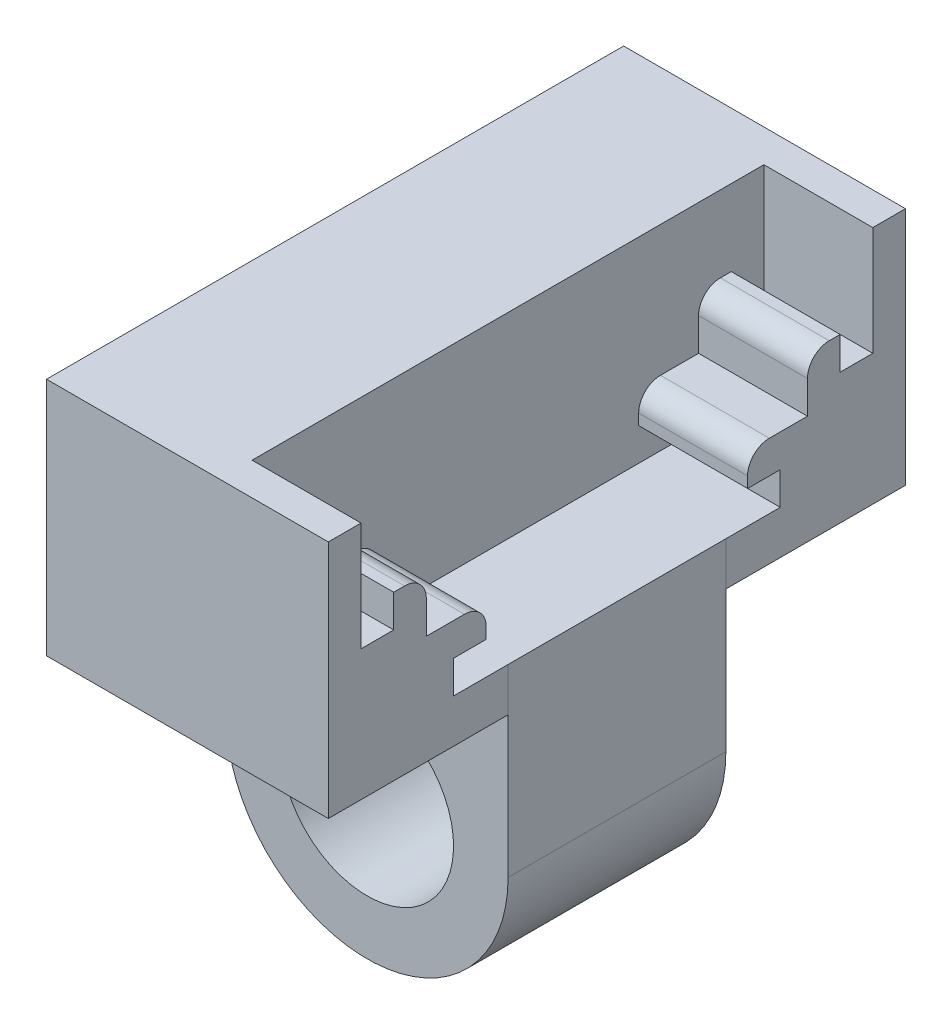
ISO-10303-21;
HEADER;
FILE_DESCRIPTION(('STEP AP214'),'2;1');
FILE_NAME('part.step','',(''),(''),'','','');
FILE_SCHEMA(('AUTOMOTIVE_DESIGN { 1 0 10303 214 1 1 1 1 }'));
ENDSEC;
DATA;
#1=APPLICATION_CONTEXT('core data for automotive mechanical design processes');
#2=APPLICATION_PROTOCOL_DEFINITION('international standard','automotive_design',2000,#1);
#3=PRODUCT_CONTEXT('',#1,'mechanical');
#4=PRODUCT('Part','Part','',(#3));
#5=PRODUCT_RELATED_PRODUCT_CATEGORY('part','',(#4));
#6=PRODUCT_DEFINITION_FORMATION('','',#4);
#7=PRODUCT_DEFINITION_CONTEXT('part definition',#1,'design');
#8=PRODUCT_DEFINITION('design','',#6,#7);
#9=PRODUCT_DEFINITION_SHAPE('','',#8);
#10=(LENGTH_UNIT() NAMED_UNIT(*) SI_UNIT(.MILLI.,.METRE.));
#11=(NAMED_UNIT(*) PLANE_ANGLE_UNIT() SI_UNIT($,.RADIAN.));
#12=(NAMED_UNIT(*) SI_UNIT($,.STERADIAN.) SOLID_ANGLE_UNIT());
#13=UNCERTAINTY_MEASURE_WITH_UNIT(LENGTH_MEASURE(1.E-05),#10,'distance_accuracy_value','');
#14=(GEOMETRIC_REPRESENTATION_CONTEXT(3) GLOBAL_UNCERTAINTY_ASSIGNED_CONTEXT((#13)) GLOBAL_UNIT_ASSIGNED_CONTEXT((#10,
#11,#12)) REPRESENTATION_CONTEXT('',''));
#15=CARTESIAN_POINT('',(0.,0.,0.));
#16=DIRECTION('',(0.,0.,1.));
#17=DIRECTION('',(1.,0.,0.));
#18=AXIS2_PLACEMENT_3D('',#15,#16,#17);
#19=CARTESIAN_POINT('',(10.,-27.5,0.));
#20=DIRECTION('',(0.,1.,0.));
#21=DIRECTION('',(0.,0.,1.));
#22=AXIS2_PLACEMENT_3D('',#19,#20,#21);
#23=PLANE('',#22);
#24=DIRECTION('',(-1.,0.,0.));
#25=VECTOR('',#24,1.);
#26=CARTESIAN_POINT('',(10.,-27.5,10.));
#27=LINE('',#26,#25);
#28=CARTESIAN_POINT('',(10.,-27.5,10.));
#29=VERTEX_POINT('',#28);
#30=CARTESIAN_POINT('',(-15.88,-27.5,9.99999999999999));
#31=VERTEX_POINT('',#30);
#32=EDGE_CURVE('E71',#29,#31,#27,.T.);
#33=ORIENTED_EDGE('',*,*,#32,.F.);
#34=DIRECTION('',(0.,0.,-1.));
#35=VECTOR('',#34,1.);
#36=CARTESIAN_POINT('',(10.,-27.5,0.));
#37=LINE('',#36,#35);
#38=CARTESIAN_POINT('',(10.,-27.5,26.5));
#39=VERTEX_POINT('',#38);
#40=EDGE_CURVE('E514',#39,#29,#37,.T.);
#41=ORIENTED_EDGE('',*,*,#40,.F.);
#42=DIRECTION('',(-1.,0.,0.));
#43=VECTOR('',#42,1.);
#44=CARTESIAN_POINT('',(10.,-27.5,26.5));
#45=LINE('',#44,#43);
#46=CARTESIAN_POINT('',(-15.88,-27.5,26.5));
#47=VERTEX_POINT('',#46);
#48=EDGE_CURVE('E558',#39,#47,#45,.T.);
#49=ORIENTED_EDGE('',*,*,#48,.T.);
#50=DIRECTION('',(0.,0.,1.));
#51=VECTOR('',#50,1.);
#52=CARTESIAN_POINT('',(-15.88,-27.5,26.5));
#53=LINE('',#52,#51);
#54=EDGE_CURVE('E508',#31,#47,#53,.T.);
#55=ORIENTED_EDGE('',*,*,#54,.F.);
#56=EDGE_LOOP('',(#33,#41,#49,#55));
#57=FACE_BOUND('',#56,.T.);
#58=ADVANCED_FACE('F47',(#57),#23,.F.);
#59=CARTESIAN_POINT('',(10.,0.,0.));
#60=DIRECTION('',(-1.,0.,0.));
#61=DIRECTION('',(0.,0.,1.));
#62=AXIS2_PLACEMENT_3D('',#59,#60,#61);
#63=PLANE('',#62);
#64=DIRECTION('',(0.,-1.,0.));
#65=VECTOR('',#64,1.);
#66=CARTESIAN_POINT('',(10.,0.,10.));
#67=LINE('',#66,#65);
#68=CARTESIAN_POINT('',(10.,-23.5,10.));
#69=VERTEX_POINT('',#68);
#70=EDGE_CURVE('E63',#69,#29,#67,.T.);
#71=ORIENTED_EDGE('',*,*,#70,.F.);
#72=DIRECTION('',(0.,0.,1.));
#73=VECTOR('',#72,1.);
#74=CARTESIAN_POINT('',(10.,-23.5,15.));
#75=LINE('',#74,#73);
#76=CARTESIAN_POINT('',(10.,-23.5,15.));
#77=VERTEX_POINT('',#76);
#78=EDGE_CURVE('E517',#69,#77,#75,.T.);
#79=ORIENTED_EDGE('',*,*,#78,.T.);
#80=DIRECTION('',(0.,1.,0.));
#81=VECTOR('',#80,1.);
#82=CARTESIAN_POINT('',(10.,-20.5,15.));
#83=LINE('',#82,#81);
#84=CARTESIAN_POINT('',(10.,-20.5,15.));
#85=VERTEX_POINT('',#84);
#86=EDGE_CURVE('E523',#77,#85,#83,.T.);
#87=ORIENTED_EDGE('',*,*,#86,.T.);
#88=DIRECTION('',(0.,0.,-1.));
#89=VECTOR('',#88,1.);
#90=CARTESIAN_POINT('',(10.,-20.5,12.));
#91=LINE('',#90,#89);
#92=CARTESIAN_POINT('',(10.,-20.5,12.));
#93=VERTEX_POINT('',#92);
#94=EDGE_CURVE('E526',#85,#93,#91,.T.);
#95=ORIENTED_EDGE('',*,*,#94,.T.);
#96=DIRECTION('',(0.,1.,0.));
#97=VECTOR('',#96,1.);
#98=CARTESIAN_POINT('',(10.,-20.5,12.));
#99=LINE('',#98,#97);
#100=CARTESIAN_POINT('',(10.,-19.5,12.));
#101=VERTEX_POINT('',#100);
#102=EDGE_CURVE('E529',#93,#101,#99,.T.);
#103=ORIENTED_EDGE('',*,*,#102,.T.);
#104=CARTESIAN_POINT('',(10.,-19.5,14.));
#105=DIRECTION('',(-1.,0.,0.));
#106=DIRECTION('',(0.,0.,1.));
#107=AXIS2_PLACEMENT_3D('',#104,#105,#106);
#108=CIRCLE('',#107,2.);
#109=CARTESIAN_POINT('',(10.,-17.5,14.));
#110=VERTEX_POINT('',#109);
#111=EDGE_CURVE('E650',#101,#110,#108,.F.);
#112=ORIENTED_EDGE('',*,*,#111,.T.);
#113=DIRECTION('',(0.,0.,1.));
#114=VECTOR('',#113,1.);
#115=CARTESIAN_POINT('',(10.,-17.5,17.5));
#116=LINE('',#115,#114);
#117=CARTESIAN_POINT('',(10.,-17.5,17.5));
#118=VERTEX_POINT('',#117);
#119=EDGE_CURVE('E533',#110,#118,#116,.T.);
#120=ORIENTED_EDGE('',*,*,#119,.T.);
#121=DIRECTION('',(0.,1.,0.));
#122=VECTOR('',#121,1.);
#123=CARTESIAN_POINT('',(10.,-12.5,17.5));
#124=LINE('',#123,#122);
#125=CARTESIAN_POINT('',(10.,-14.5,17.5));
#126=VERTEX_POINT('',#125);
#127=EDGE_CURVE('E536',#118,#126,#124,.T.);
#128=ORIENTED_EDGE('',*,*,#127,.T.);
#129=CARTESIAN_POINT('',(10.,-14.5,19.5));
#130=DIRECTION('',(-1.,0.,0.));
#131=DIRECTION('',(0.,0.,1.));
#132=AXIS2_PLACEMENT_3D('',#129,#130,#131);
#133=CIRCLE('',#132,2.);
#134=CARTESIAN_POINT('',(10.,-12.5,19.5));
#135=VERTEX_POINT('',#134);
#136=EDGE_CURVE('E647',#126,#135,#133,.F.);
#137=ORIENTED_EDGE('',*,*,#136,.T.);
#138=DIRECTION('',(0.,0.,1.));
#139=VECTOR('',#138,1.);
#140=CARTESIAN_POINT('',(10.,-12.5,20.5));
#141=LINE('',#140,#139);
#142=CARTESIAN_POINT('',(10.,-12.5,20.5));
#143=VERTEX_POINT('',#142);
#144=EDGE_CURVE('E540',#135,#143,#141,.T.);
#145=ORIENTED_EDGE('',*,*,#144,.T.);
#146=DIRECTION('',(0.,-1.,0.));
#147=VECTOR('',#146,1.);
#148=CARTESIAN_POINT('',(10.,-15.5,20.5));
#149=LINE('',#148,#147);
#150=CARTESIAN_POINT('',(10.,-15.5,20.5));
#151=VERTEX_POINT('',#150);
#152=EDGE_CURVE('E543',#143,#151,#149,.T.);
#153=ORIENTED_EDGE('',*,*,#152,.T.);
#154=DIRECTION('',(0.,0.,1.));
#155=VECTOR('',#154,1.);
#156=CARTESIAN_POINT('',(10.,-15.5,23.5));
#157=LINE('',#156,#155);
#158=CARTESIAN_POINT('',(10.,-15.5,23.5));
#159=VERTEX_POINT('',#158);
#160=EDGE_CURVE('E546',#151,#159,#157,.T.);
#161=ORIENTED_EDGE('',*,*,#160,.T.);
#162=DIRECTION('',(0.,1.,0.));
#163=VECTOR('',#162,1.);
#164=CARTESIAN_POINT('',(10.,-5.50000000000001,23.5));
#165=LINE('',#164,#163);
#166=CARTESIAN_POINT('',(10.,-5.50000000000001,23.5));
#167=VERTEX_POINT('',#166);
#168=EDGE_CURVE('E549',#159,#167,#165,.T.);
#169=ORIENTED_EDGE('',*,*,#168,.T.);
#170=DIRECTION('',(0.,0.,1.));
#171=VECTOR('',#170,1.);
#172=CARTESIAN_POINT('',(10.,-5.50000000000001,23.5));
#173=LINE('',#172,#171);
#174=CARTESIAN_POINT('',(10.,-5.50000000000001,26.5));
#175=VERTEX_POINT('',#174);
#176=EDGE_CURVE('E552',#167,#175,#173,.T.);
#177=ORIENTED_EDGE('',*,*,#176,.T.);
#178=DIRECTION('',(0.,-1.,0.));
#179=VECTOR('',#178,1.);
#180=CARTESIAN_POINT('',(10.,-27.5,26.5));
#181=LINE('',#180,#179);
#182=EDGE_CURVE('E555',#175,#39,#181,.T.);
#183=ORIENTED_EDGE('',*,*,#182,.T.);
#184=ORIENTED_EDGE('',*,*,#40,.T.);
#185=EDGE_LOOP('',(#71,#79,#87,#95,#103,#112,#120,#128,#137,#145,#153,#161,#169,#177,#183,#184));
#186=FACE_BOUND('',#185,.T.);
#187=ADVANCED_FACE('F664',(#186),#63,.F.);
#188=CARTESIAN_POINT('',(10.,-23.5,15.));
#189=DIRECTION('',(0.,-1.,0.));
#190=DIRECTION('',(0.,0.,-1.));
#191=AXIS2_PLACEMENT_3D('',#188,#189,#190);
#192=PLANE('',#191);
#193=DIRECTION('',(0.,0.,1.));
#194=VECTOR('',#193,1.);
#195=CARTESIAN_POINT('',(0.,-23.5,15.));
#196=LINE('',#195,#194);
#197=CARTESIAN_POINT('',(0.,-23.5,-15.));
#198=VERTEX_POINT('',#197);
#199=CARTESIAN_POINT('',(0.,-23.5,15.));
#200=VERTEX_POINT('',#199);
#201=EDGE_CURVE('E511',#198,#200,#196,.T.);
#202=ORIENTED_EDGE('',*,*,#201,.T.);
#203=DIRECTION('',(-1.,0.,0.));
#204=VECTOR('',#203,1.);
#205=CARTESIAN_POINT('',(10.,-23.5,15.));
#206=LINE('',#205,#204);
#207=EDGE_CURVE('E630',#77,#200,#206,.T.);
#208=ORIENTED_EDGE('',*,*,#207,.F.);
#209=ORIENTED_EDGE('',*,*,#78,.F.);
#210=CARTESIAN_POINT('',(10.,-23.5,-10.));
#211=VERTEX_POINT('',#210);
#212=EDGE_CURVE('E519',#211,#69,#75,.T.);
#213=ORIENTED_EDGE('',*,*,#212,.F.);
#214=DIRECTION('',(0.,0.,-1.));
#215=VECTOR('',#214,1.);
#216=CARTESIAN_POINT('',(10.,-23.5,-15.));
#217=LINE('',#216,#215);
#218=CARTESIAN_POINT('',(10.,-23.5,-15.));
#219=VERTEX_POINT('',#218);
#220=EDGE_CURVE('E326',#211,#219,#217,.T.);
#221=ORIENTED_EDGE('',*,*,#220,.T.);
#222=DIRECTION('',(-1.,0.,0.));
#223=VECTOR('',#222,1.);
#224=CARTESIAN_POINT('',(10.,-23.5,-15.));
#225=LINE('',#224,#223);
#226=EDGE_CURVE('E444',#219,#198,#225,.T.);
#227=ORIENTED_EDGE('',*,*,#226,.T.);
#228=EDGE_LOOP('',(#202,#208,#209,#213,#221,#227));
#229=FACE_BOUND('',#228,.T.);
#230=ADVANCED_FACE('F701',(#229),#192,.F.);
#231=CARTESIAN_POINT('',(10.,-20.5,15.));
#232=DIRECTION('',(0.,0.,1.));
#233=DIRECTION('',(1.,0.,0.));
#234=AXIS2_PLACEMENT_3D('',#231,#232,#233);
#235=PLANE('',#234);
#236=DIRECTION('',(0.,1.,0.));
#237=VECTOR('',#236,1.);
#238=CARTESIAN_POINT('',(0.,-20.5,15.));
#239=LINE('',#238,#237);
#240=CARTESIAN_POINT('',(0.,-20.5,15.));
#241=VERTEX_POINT('',#240);
#242=EDGE_CURVE('E561',#200,#241,#239,.T.);
#243=ORIENTED_EDGE('',*,*,#242,.T.);
#244=DIRECTION('',(-1.,0.,0.));
#245=VECTOR('',#244,1.);
#246=CARTESIAN_POINT('',(10.,-20.5,15.));
#247=LINE('',#246,#245);
#248=EDGE_CURVE('E626',#85,#241,#247,.T.);
#249=ORIENTED_EDGE('',*,*,#248,.F.);
#250=ORIENTED_EDGE('',*,*,#86,.F.);
#251=ORIENTED_EDGE('',*,*,#207,.T.);
#252=EDGE_LOOP('',(#243,#249,#250,#251));
#253=FACE_BOUND('',#252,.T.);
#254=ADVANCED_FACE('F710',(#253),#235,.F.);
#255=CARTESIAN_POINT('',(10.,-20.5,12.));
#256=DIRECTION('',(0.,1.,0.));
#257=DIRECTION('',(0.,0.,1.));
#258=AXIS2_PLACEMENT_3D('',#255,#256,#257);
#259=PLANE('',#258);
#260=DIRECTION('',(0.,0.,-1.));
#261=VECTOR('',#260,1.);
#262=CARTESIAN_POINT('',(0.,-20.5,12.));
#263=LINE('',#262,#261);
#264=CARTESIAN_POINT('',(0.,-20.5,12.));
#265=VERTEX_POINT('',#264);
#266=EDGE_CURVE('E565',#241,#265,#263,.T.);
#267=ORIENTED_EDGE('',*,*,#266,.T.);
#268=DIRECTION('',(-1.,0.,0.));
#269=VECTOR('',#268,1.);
#270=CARTESIAN_POINT('',(10.,-20.5,12.));
#271=LINE('',#270,#269);
#272=EDGE_CURVE('E622',#93,#265,#271,.T.);
#273=ORIENTED_EDGE('',*,*,#272,.F.);
#274=ORIENTED_EDGE('',*,*,#94,.F.);
#275=ORIENTED_EDGE('',*,*,#248,.T.);
#276=EDGE_LOOP('',(#267,#273,#274,#275));
#277=FACE_BOUND('',#276,.T.);
#278=ADVANCED_FACE('F713',(#277),#259,.F.);
#279=CARTESIAN_POINT('',(10.,-20.5,12.));
#280=DIRECTION('',(0.,0.,1.));
#281=DIRECTION('',(0.,-1.,0.));
#282=AXIS2_PLACEMENT_3D('',#279,#280,#281);
#283=PLANE('',#282);
#284=DIRECTION('',(0.,1.,0.));
#285=VECTOR('',#284,1.);
#286=CARTESIAN_POINT('',(0.,-20.5,12.));
#287=LINE('',#286,#285);
#288=CARTESIAN_POINT('',(0.,-19.5,12.));
#289=VERTEX_POINT('',#288);
#290=EDGE_CURVE('E569',#265,#289,#287,.T.);
#291=ORIENTED_EDGE('',*,*,#290,.T.);
#292=DIRECTION('',(-1.,0.,0.));
#293=VECTOR('',#292,1.);
#294=CARTESIAN_POINT('',(10.,-19.5,12.));
#295=LINE('',#294,#293);
#296=EDGE_CURVE('E644',#289,#101,#295,.F.);
#297=ORIENTED_EDGE('',*,*,#296,.T.);
#298=ORIENTED_EDGE('',*,*,#102,.F.);
#299=ORIENTED_EDGE('',*,*,#272,.T.);
#300=EDGE_LOOP('',(#291,#297,#298,#299));
#301=FACE_BOUND('',#300,.T.);
#302=ADVANCED_FACE('F716',(#301),#283,.F.);
#303=CARTESIAN_POINT('',(10.,-17.5,17.5));
#304=DIRECTION('',(0.,-1.,0.));
#305=DIRECTION('',(0.,0.,-1.));
#306=AXIS2_PLACEMENT_3D('',#303,#304,#305);
#307=PLANE('',#306);
#308=ORIENTED_EDGE('',*,*,#119,.F.);
#309=DIRECTION('',(-1.,0.,0.));
#310=VECTOR('',#309,1.);
#311=CARTESIAN_POINT('',(10.,-17.5,14.));
#312=LINE('',#311,#310);
#313=CARTESIAN_POINT('',(0.,-17.5,14.));
#314=VERTEX_POINT('',#313);
#315=EDGE_CURVE('E634',#110,#314,#312,.T.);
#316=ORIENTED_EDGE('',*,*,#315,.T.);
#317=DIRECTION('',(0.,0.,1.));
#318=VECTOR('',#317,1.);
#319=CARTESIAN_POINT('',(0.,-17.5,17.5));
#320=LINE('',#319,#318);
#321=CARTESIAN_POINT('',(0.,-17.5,17.5));
#322=VERTEX_POINT('',#321);
#323=EDGE_CURVE('E573',#314,#322,#320,.T.);
#324=ORIENTED_EDGE('',*,*,#323,.T.);
#325=DIRECTION('',(-1.,0.,0.));
#326=VECTOR('',#325,1.);
#327=CARTESIAN_POINT('',(10.,-17.5,17.5));
#328=LINE('',#327,#326);
#329=EDGE_CURVE('E618',#118,#322,#328,.T.);
#330=ORIENTED_EDGE('',*,*,#329,.F.);
#331=EDGE_LOOP('',(#308,#316,#324,#330));
#332=FACE_BOUND('',#331,.T.);
#333=ADVANCED_FACE('F724',(#332),#307,.F.);
#334=CARTESIAN_POINT('',(10.,-12.5,17.5));
#335=DIRECTION('',(0.,0.,1.));
#336=DIRECTION('',(1.,0.,0.));
#337=AXIS2_PLACEMENT_3D('',#334,#335,#336);
#338=PLANE('',#337);
#339=DIRECTION('',(0.,1.,0.));
#340=VECTOR('',#339,1.);
#341=CARTESIAN_POINT('',(0.,-12.5,17.5));
#342=LINE('',#341,#340);
#343=CARTESIAN_POINT('',(0.,-14.5,17.5));
#344=VERTEX_POINT('',#343);
#345=EDGE_CURVE('E577',#322,#344,#342,.T.);
#346=ORIENTED_EDGE('',*,*,#345,.T.);
#347=DIRECTION('',(-1.,0.,0.));
#348=VECTOR('',#347,1.);
#349=CARTESIAN_POINT('',(10.,-14.5,17.5));
#350=LINE('',#349,#348);
#351=EDGE_CURVE('E56',#344,#126,#350,.F.);
#352=ORIENTED_EDGE('',*,*,#351,.T.);
#353=ORIENTED_EDGE('',*,*,#127,.F.);
#354=ORIENTED_EDGE('',*,*,#329,.T.);
#355=EDGE_LOOP('',(#346,#352,#353,#354));
#356=FACE_BOUND('',#355,.T.);
#357=ADVANCED_FACE('F660',(#356),#338,.F.);
#358=CARTESIAN_POINT('',(10.,-12.5,20.5));
#359=DIRECTION('',(0.,-1.,0.));
#360=DIRECTION('',(0.,0.,-1.));
#361=AXIS2_PLACEMENT_3D('',#358,#359,#360);
#362=PLANE('',#361);
#363=ORIENTED_EDGE('',*,*,#144,.F.);
#364=DIRECTION('',(-1.,0.,0.));
#365=VECTOR('',#364,1.);
#366=CARTESIAN_POINT('',(10.,-12.5,19.5));
#367=LINE('',#366,#365);
#368=CARTESIAN_POINT('',(0.,-12.5,19.5));
#369=VERTEX_POINT('',#368);
#370=EDGE_CURVE('E653',#135,#369,#367,.T.);
#371=ORIENTED_EDGE('',*,*,#370,.T.);
#372=DIRECTION('',(0.,0.,1.));
#373=VECTOR('',#372,1.);
#374=CARTESIAN_POINT('',(0.,-12.5,20.5));
#375=LINE('',#374,#373);
#376=CARTESIAN_POINT('',(0.,-12.5,20.5));
#377=VERTEX_POINT('',#376);
#378=EDGE_CURVE('E581',#369,#377,#375,.T.);
#379=ORIENTED_EDGE('',*,*,#378,.T.);
#380=DIRECTION('',(-1.,0.,0.));
#381=VECTOR('',#380,1.);
#382=CARTESIAN_POINT('',(10.,-12.5,20.5));
#383=LINE('',#382,#381);
#384=EDGE_CURVE('E614',#143,#377,#383,.T.);
#385=ORIENTED_EDGE('',*,*,#384,.F.);
#386=EDGE_LOOP('',(#363,#371,#379,#385));
#387=FACE_BOUND('',#386,.T.);
#388=ADVANCED_FACE('F670',(#387),#362,.F.);
#389=CARTESIAN_POINT('',(10.,-15.5,20.5));
#390=DIRECTION('',(0.,0.,-1.));
#391=DIRECTION('',(-1.,0.,0.));
#392=AXIS2_PLACEMENT_3D('',#389,#390,#391);
#393=PLANE('',#392);
#394=DIRECTION('',(0.,-1.,0.));
#395=VECTOR('',#394,1.);
#396=CARTESIAN_POINT('',(0.,-15.5,20.5));
#397=LINE('',#396,#395);
#398=CARTESIAN_POINT('',(0.,-15.5,20.5));
#399=VERTEX_POINT('',#398);
#400=EDGE_CURVE('E585',#377,#399,#397,.T.);
#401=ORIENTED_EDGE('',*,*,#400,.T.);
#402=DIRECTION('',(-1.,0.,0.));
#403=VECTOR('',#402,1.);
#404=CARTESIAN_POINT('',(10.,-15.5,20.5));
#405=LINE('',#404,#403);
#406=EDGE_CURVE('E610',#151,#399,#405,.T.);
#407=ORIENTED_EDGE('',*,*,#406,.F.);
#408=ORIENTED_EDGE('',*,*,#152,.F.);
#409=ORIENTED_EDGE('',*,*,#384,.T.);
#410=EDGE_LOOP('',(#401,#407,#408,#409));
#411=FACE_BOUND('',#410,.T.);
#412=ADVANCED_FACE('F677',(#411),#393,.F.);
#413=CARTESIAN_POINT('',(10.,-15.5,23.5));
#414=DIRECTION('',(0.,-1.,0.));
#415=DIRECTION('',(0.,0.,-1.));
#416=AXIS2_PLACEMENT_3D('',#413,#414,#415);
#417=PLANE('',#416);
#418=DIRECTION('',(0.,0.,1.));
#419=VECTOR('',#418,1.);
#420=CARTESIAN_POINT('',(0.,-15.5,23.5));
#421=LINE('',#420,#419);
#422=CARTESIAN_POINT('',(0.,-15.5,23.5));
#423=VERTEX_POINT('',#422);
#424=EDGE_CURVE('E589',#399,#423,#421,.T.);
#425=ORIENTED_EDGE('',*,*,#424,.T.);
#426=DIRECTION('',(-1.,0.,0.));
#427=VECTOR('',#426,1.);
#428=CARTESIAN_POINT('',(10.,-15.5,23.5));
#429=LINE('',#428,#427);
#430=EDGE_CURVE('E606',#159,#423,#429,.T.);
#431=ORIENTED_EDGE('',*,*,#430,.F.);
#432=ORIENTED_EDGE('',*,*,#160,.F.);
#433=ORIENTED_EDGE('',*,*,#406,.T.);
#434=EDGE_LOOP('',(#425,#431,#432,#433));
#435=FACE_BOUND('',#434,.T.);
#436=ADVANCED_FACE('F679',(#435),#417,.F.);
#437=CARTESIAN_POINT('',(10.,-5.50000000000001,23.5));
#438=DIRECTION('',(0.,0.,1.));
#439=DIRECTION('',(0.,-1.,0.));
#440=AXIS2_PLACEMENT_3D('',#437,#438,#439);
#441=PLANE('',#440);
#442=DIRECTION('',(0.,1.,0.));
#443=VECTOR('',#442,1.);
#444=CARTESIAN_POINT('',(0.,-5.50000000000001,23.5));
#445=LINE('',#444,#443);
#446=CARTESIAN_POINT('',(0.,-5.50000000000001,23.5));
#447=VERTEX_POINT('',#446);
#448=EDGE_CURVE('E518',#423,#447,#445,.T.);
#449=ORIENTED_EDGE('',*,*,#448,.T.);
#450=DIRECTION('',(-1.,0.,0.));
#451=VECTOR('',#450,1.);
#452=CARTESIAN_POINT('',(10.,-5.50000000000001,23.5));
#453=LINE('',#452,#451);
#454=EDGE_CURVE('E602',#167,#447,#453,.T.);
#455=ORIENTED_EDGE('',*,*,#454,.F.);
#456=ORIENTED_EDGE('',*,*,#168,.F.);
#457=ORIENTED_EDGE('',*,*,#430,.T.);
#458=EDGE_LOOP('',(#449,#455,#456,#457));
#459=FACE_BOUND('',#458,.T.);
#460=ADVANCED_FACE('F683',(#459),#441,.F.);
#461=CARTESIAN_POINT('',(10.,-5.50000000000001,23.5));
#462=DIRECTION('',(0.,-1.,0.));
#463=DIRECTION('',(0.,0.,-1.));
#464=AXIS2_PLACEMENT_3D('',#461,#462,#463);
#465=PLANE('',#464);
#466=ORIENTED_EDGE('',*,*,#454,.T.);
#467=DIRECTION('',(0.,0.,-1.));
#468=VECTOR('',#467,1.);
#469=CARTESIAN_POINT('',(0.,-5.50000000000001,26.5));
#470=LINE('',#469,#468);
#471=CARTESIAN_POINT('',(0.,-5.5,-23.5));
#472=VERTEX_POINT('',#471);
#473=EDGE_CURVE('E500',#447,#472,#470,.T.);
#474=ORIENTED_EDGE('',*,*,#473,.T.);
#475=DIRECTION('',(-1.,0.,0.));
#476=VECTOR('',#475,1.);
#477=CARTESIAN_POINT('',(10.,-5.5,-23.5));
#478=LINE('',#477,#476);
#479=CARTESIAN_POINT('',(10.,-5.5,-23.5));
#480=VERTEX_POINT('',#479);
#481=EDGE_CURVE('E416',#480,#472,#478,.T.);
#482=ORIENTED_EDGE('',*,*,#481,.F.);
#483=DIRECTION('',(0.,0.,-1.));
#484=VECTOR('',#483,1.);
#485=CARTESIAN_POINT('',(10.,-5.5,-23.5));
#486=LINE('',#485,#484);
#487=CARTESIAN_POINT('',(10.,-5.5,-26.5));
#488=VERTEX_POINT('',#487);
#489=EDGE_CURVE('E367',#480,#488,#486,.T.);
#490=ORIENTED_EDGE('',*,*,#489,.T.);
#491=DIRECTION('',(-1.,0.,0.));
#492=VECTOR('',#491,1.);
#493=CARTESIAN_POINT('',(10.,-5.5,-26.5));
#494=LINE('',#493,#492);
#495=CARTESIAN_POINT('',(-15.88,-5.5,-26.5));
#496=VERTEX_POINT('',#495);
#497=EDGE_CURVE('E412',#488,#496,#494,.T.);
#498=ORIENTED_EDGE('',*,*,#497,.T.);
#499=DIRECTION('',(0.,0.,-1.));
#500=VECTOR('',#499,1.);
#501=CARTESIAN_POINT('',(-15.88,-5.50000000000001,26.5));
#502=LINE('',#501,#500);
#503=CARTESIAN_POINT('',(-15.88,-5.50000000000001,26.5));
#504=VERTEX_POINT('',#503);
#505=EDGE_CURVE('E505',#504,#496,#502,.T.);
#506=ORIENTED_EDGE('',*,*,#505,.F.);
#507=DIRECTION('',(-1.,0.,0.));
#508=VECTOR('',#507,1.);
#509=CARTESIAN_POINT('',(10.,-5.50000000000001,26.5));
#510=LINE('',#509,#508);
#511=EDGE_CURVE('E599',#175,#504,#510,.T.);
#512=ORIENTED_EDGE('',*,*,#511,.F.);
#513=ORIENTED_EDGE('',*,*,#176,.F.);
#514=EDGE_LOOP('',(#466,#474,#482,#490,#498,#506,#512,#513));
#515=FACE_BOUND('',#514,.T.);
#516=ADVANCED_FACE('F690',(#515),#465,.F.);
#517=CARTESIAN_POINT('',(10.,-27.5,26.5));
#518=DIRECTION('',(0.,0.,-1.));
#519=DIRECTION('',(-1.,0.,0.));
#520=AXIS2_PLACEMENT_3D('',#517,#518,#519);
#521=PLANE('',#520);
#522=ORIENTED_EDGE('',*,*,#511,.T.);
#523=DIRECTION('',(0.,1.,0.));
#524=VECTOR('',#523,1.);
#525=CARTESIAN_POINT('',(-15.88,-5.50000000000001,26.5));
#526=LINE('',#525,#524);
#527=EDGE_CURVE('E501',#47,#504,#526,.T.);
#528=ORIENTED_EDGE('',*,*,#527,.F.);
#529=ORIENTED_EDGE('',*,*,#48,.F.);
#530=ORIENTED_EDGE('',*,*,#182,.F.);
#531=EDGE_LOOP('',(#522,#528,#529,#530));
#532=FACE_BOUND('',#531,.T.);
#533=ADVANCED_FACE('F693',(#532),#521,.F.);
#534=CARTESIAN_POINT('',(10.,-19.5,14.));
#535=DIRECTION('',(-1.,0.,0.));
#536=DIRECTION('',(0.,0.,1.));
#537=AXIS2_PLACEMENT_3D('',#534,#535,#536);
#538=CYLINDRICAL_SURFACE('',#537,2.);
#539=ORIENTED_EDGE('',*,*,#111,.F.);
#540=ORIENTED_EDGE('',*,*,#296,.F.);
#541=CARTESIAN_POINT('',(0.,-19.5,14.));
#542=DIRECTION('',(-1.,0.,0.));
#543=DIRECTION('',(0.,0.,1.));
#544=AXIS2_PLACEMENT_3D('',#541,#542,#543);
#545=CIRCLE('',#544,2.);
#546=EDGE_CURVE('E641',#314,#289,#545,.T.);
#547=ORIENTED_EDGE('',*,*,#546,.F.);
#548=ORIENTED_EDGE('',*,*,#315,.F.);
#549=EDGE_LOOP('',(#539,#540,#547,#548));
#550=FACE_BOUND('',#549,.T.);
#551=ADVANCED_FACE('F721',(#550),#538,.T.);
#552=CARTESIAN_POINT('',(10.,-14.5,19.5));
#553=DIRECTION('',(-1.,0.,0.));
#554=DIRECTION('',(0.,0.,1.));
#555=AXIS2_PLACEMENT_3D('',#552,#553,#554);
#556=CYLINDRICAL_SURFACE('',#555,2.);
#557=ORIENTED_EDGE('',*,*,#136,.F.);
#558=ORIENTED_EDGE('',*,*,#351,.F.);
#559=CARTESIAN_POINT('',(0.,-14.5,19.5));
#560=DIRECTION('',(-1.,0.,0.));
#561=DIRECTION('',(0.,0.,1.));
#562=AXIS2_PLACEMENT_3D('',#559,#560,#561);
#563=CIRCLE('',#562,2.);
#564=EDGE_CURVE('E638',#369,#344,#563,.T.);
#565=ORIENTED_EDGE('',*,*,#564,.F.);
#566=ORIENTED_EDGE('',*,*,#370,.F.);
#567=EDGE_LOOP('',(#557,#558,#565,#566));
#568=FACE_BOUND('',#567,.T.);
#569=ADVANCED_FACE('F49',(#568),#556,.T.);
#570=CARTESIAN_POINT('',(0.,0.,0.));
#571=DIRECTION('',(1.,0.,0.));
#572=DIRECTION('',(0.,0.,-1.));
#573=AXIS2_PLACEMENT_3D('',#570,#571,#572);
#574=PLANE('',#573);
#575=ORIENTED_EDGE('',*,*,#201,.F.);
#576=DIRECTION('',(0.,1.,0.));
#577=VECTOR('',#576,1.);
#578=CARTESIAN_POINT('',(0.,-20.5,-15.));
#579=LINE('',#578,#577);
#580=CARTESIAN_POINT('',(0.,-20.5,-15.));
#581=VERTEX_POINT('',#580);
#582=EDGE_CURVE('E321',#198,#581,#579,.T.);
#583=ORIENTED_EDGE('',*,*,#582,.T.);
#584=DIRECTION('',(0.,0.,1.));
#585=VECTOR('',#584,1.);
#586=CARTESIAN_POINT('',(0.,-20.5,-12.));
#587=LINE('',#586,#585);
#588=CARTESIAN_POINT('',(0.,-20.5,-12.));
#589=VERTEX_POINT('',#588);
#590=EDGE_CURVE('E378',#581,#589,#587,.T.);
#591=ORIENTED_EDGE('',*,*,#590,.T.);
#592=DIRECTION('',(0.,1.,0.));
#593=VECTOR('',#592,1.);
#594=CARTESIAN_POINT('',(0.,-20.5,-12.));
#595=LINE('',#594,#593);
#596=CARTESIAN_POINT('',(0.,-19.5,-12.));
#597=VERTEX_POINT('',#596);
#598=EDGE_CURVE('E382',#589,#597,#595,.T.);
#599=ORIENTED_EDGE('',*,*,#598,.T.);
#600=CARTESIAN_POINT('',(0.,-19.5,-14.));
#601=DIRECTION('',(1.,0.,0.));
#602=DIRECTION('',(0.,0.,-1.));
#603=AXIS2_PLACEMENT_3D('',#600,#601,#602);
#604=CIRCLE('',#603,2.);
#605=CARTESIAN_POINT('',(0.,-17.5,-14.));
#606=VERTEX_POINT('',#605);
#607=EDGE_CURVE('E455',#606,#597,#604,.T.);
#608=ORIENTED_EDGE('',*,*,#607,.F.);
#609=DIRECTION('',(0.,0.,-1.));
#610=VECTOR('',#609,1.);
#611=CARTESIAN_POINT('',(0.,-17.5,-17.5));
#612=LINE('',#611,#610);
#613=CARTESIAN_POINT('',(0.,-17.5,-17.5));
#614=VERTEX_POINT('',#613);
#615=EDGE_CURVE('E386',#606,#614,#612,.T.);
#616=ORIENTED_EDGE('',*,*,#615,.T.);
#617=DIRECTION('',(0.,1.,0.));
#618=VECTOR('',#617,1.);
#619=CARTESIAN_POINT('',(0.,-12.5,-17.5));
#620=LINE('',#619,#618);
#621=CARTESIAN_POINT('',(0.,-14.5,-17.5));
#622=VERTEX_POINT('',#621);
#623=EDGE_CURVE('E390',#614,#622,#620,.T.);
#624=ORIENTED_EDGE('',*,*,#623,.T.);
#625=CARTESIAN_POINT('',(0.,-14.5,-19.5));
#626=DIRECTION('',(1.,0.,0.));
#627=DIRECTION('',(0.,0.,-1.));
#628=AXIS2_PLACEMENT_3D('',#625,#626,#627);
#629=CIRCLE('',#628,2.);
#630=CARTESIAN_POINT('',(0.,-12.5,-19.5));
#631=VERTEX_POINT('',#630);
#632=EDGE_CURVE('E452',#631,#622,#629,.T.);
#633=ORIENTED_EDGE('',*,*,#632,.F.);
#634=DIRECTION('',(0.,0.,-1.));
#635=VECTOR('',#634,1.);
#636=CARTESIAN_POINT('',(0.,-12.5,-20.5));
#637=LINE('',#636,#635);
#638=CARTESIAN_POINT('',(0.,-12.5,-20.5));
#639=VERTEX_POINT('',#638);
#640=EDGE_CURVE('E394',#631,#639,#637,.T.);
#641=ORIENTED_EDGE('',*,*,#640,.T.);
#642=DIRECTION('',(0.,-1.,0.));
#643=VECTOR('',#642,1.);
#644=CARTESIAN_POINT('',(0.,-15.5,-20.5));
#645=LINE('',#644,#643);
#646=CARTESIAN_POINT('',(0.,-15.5,-20.5));
#647=VERTEX_POINT('',#646);
#648=EDGE_CURVE('E398',#639,#647,#645,.T.);
#649=ORIENTED_EDGE('',*,*,#648,.T.);
#650=DIRECTION('',(0.,0.,-1.));
#651=VECTOR('',#650,1.);
#652=CARTESIAN_POINT('',(0.,-15.5,-23.5));
#653=LINE('',#652,#651);
#654=CARTESIAN_POINT('',(0.,-15.5,-23.5));
#655=VERTEX_POINT('',#654);
#656=EDGE_CURVE('E402',#647,#655,#653,.T.);
#657=ORIENTED_EDGE('',*,*,#656,.T.);
#658=DIRECTION('',(0.,1.,0.));
#659=VECTOR('',#658,1.);
#660=CARTESIAN_POINT('',(0.,-5.5,-23.5));
#661=LINE('',#660,#659);
#662=EDGE_CURVE('E327',#655,#472,#661,.T.);
#663=ORIENTED_EDGE('',*,*,#662,.T.);
#664=ORIENTED_EDGE('',*,*,#473,.F.);
#665=ORIENTED_EDGE('',*,*,#448,.F.);
#666=ORIENTED_EDGE('',*,*,#424,.F.);
#667=ORIENTED_EDGE('',*,*,#400,.F.);
#668=ORIENTED_EDGE('',*,*,#378,.F.);
#669=ORIENTED_EDGE('',*,*,#564,.T.);
#670=ORIENTED_EDGE('',*,*,#345,.F.);
#671=ORIENTED_EDGE('',*,*,#323,.F.);
#672=ORIENTED_EDGE('',*,*,#546,.T.);
#673=ORIENTED_EDGE('',*,*,#290,.F.);
#674=ORIENTED_EDGE('',*,*,#266,.F.);
#675=ORIENTED_EDGE('',*,*,#242,.F.);
#676=EDGE_LOOP('',(#575,#583,#591,#599,#608,#616,#624,#633,#641,#649,#657,#663,#664,#665,#666,
#667,#668,#669,#670,#671,#672,#673,#674,#675));
#677=FACE_BOUND('',#676,.T.);
#678=ADVANCED_FACE('F726',(#677),#574,.T.);
#679=CARTESIAN_POINT('',(-15.88,0.,0.));
#680=DIRECTION('',(1.,0.,0.));
#681=DIRECTION('',(0.,0.,-1.));
#682=AXIS2_PLACEMENT_3D('',#679,#680,#681);
#683=PLANE('',#682);
#684=ORIENTED_EDGE('',*,*,#505,.T.);
#685=DIRECTION('',(0.,1.,0.));
#686=VECTOR('',#685,1.);
#687=CARTESIAN_POINT('',(-15.88,-5.5,-26.5));
#688=LINE('',#687,#686);
#689=CARTESIAN_POINT('',(-15.88,-27.5,-26.5));
#690=VERTEX_POINT('',#689);
#691=EDGE_CURVE('E313',#690,#496,#688,.T.);
#692=ORIENTED_EDGE('',*,*,#691,.F.);
#693=DIRECTION('',(0.,0.,-1.));
#694=VECTOR('',#693,1.);
#695=CARTESIAN_POINT('',(-15.88,-27.5,-26.5));
#696=LINE('',#695,#694);
#697=CARTESIAN_POINT('',(-15.88,-27.5,-10.));
#698=VERTEX_POINT('',#697);
#699=EDGE_CURVE('E317',#698,#690,#696,.T.);
#700=ORIENTED_EDGE('',*,*,#699,.F.);
#701=DIRECTION('',(0.,1.,0.));
#702=VECTOR('',#701,1.);
#703=CARTESIAN_POINT('',(-15.88,0.,-10.));
#704=LINE('',#703,#702);
#705=CARTESIAN_POINT('',(-15.88,-23.5,-10.));
#706=VERTEX_POINT('',#705);
#707=EDGE_CURVE('E476',#698,#706,#704,.T.);
#708=ORIENTED_EDGE('',*,*,#707,.T.);
#709=DIRECTION('',(0.,0.,-1.));
#710=VECTOR('',#709,1.);
#711=CARTESIAN_POINT('',(-15.88,-23.5,10.));
#712=LINE('',#711,#710);
#713=CARTESIAN_POINT('',(-15.88,-23.5,10.));
#714=VERTEX_POINT('',#713);
#715=EDGE_CURVE('E283',#714,#706,#712,.T.);
#716=ORIENTED_EDGE('',*,*,#715,.F.);
#717=DIRECTION('',(0.,1.,0.));
#718=VECTOR('',#717,1.);
#719=CARTESIAN_POINT('',(-15.88,0.,10.));
#720=LINE('',#719,#718);
#721=EDGE_CURVE('E11',#31,#714,#720,.T.);
#722=ORIENTED_EDGE('',*,*,#721,.F.);
#723=ORIENTED_EDGE('',*,*,#54,.T.);
#724=ORIENTED_EDGE('',*,*,#527,.T.);
#725=EDGE_LOOP('',(#684,#692,#700,#708,#716,#722,#723,#724));
#726=FACE_BOUND('',#725,.T.);
#727=ADVANCED_FACE('F747',(#726),#683,.F.);
#728=CARTESIAN_POINT('',(-2.93832430285871,-40.4375,9.99999999999999));
#729=DIRECTION('',(0.,0.,-1.));
#730=DIRECTION('',(0.,1.,0.));
#731=AXIS2_PLACEMENT_3D('',#728,#729,#730);
#732=PLANE('',#731);
#733=CARTESIAN_POINT('',(-2.93832430285871,-40.4375,9.99999999999999));
#734=DIRECTION('',(0.,0.,-1.));
#735=DIRECTION('',(0.,1.,0.));
#736=AXIS2_PLACEMENT_3D('',#733,#734,#735);
#737=CIRCLE('',#736,7.9375);
#738=CARTESIAN_POINT('',(-2.93832430285871,-32.5,10.));
#739=VERTEX_POINT('',#738);
#740=EDGE_CURVE('E479',#739,#739,#737,.T.);
#741=ORIENTED_EDGE('',*,*,#740,.T.);
#742=EDGE_LOOP('',(#741));
#743=FACE_BOUND('',#742,.T.);
#744=DIRECTION('',(0.000335139409441132,-0.999999943840786,0.));
#745=VECTOR('',#744,1.);
#746=CARTESIAN_POINT('',(10.0056749702164,-40.4331619554842,9.99999999999999));
#747=LINE('',#746,#745);
#748=CARTESIAN_POINT('',(10.0056749702164,-40.4331619554842,9.99999999999999));
#749=VERTEX_POINT('',#748);
#750=EDGE_CURVE('E284',#69,#749,#747,.T.);
#751=ORIENTED_EDGE('',*,*,#750,.F.);
#752=ORIENTED_EDGE('',*,*,#70,.T.);
#753=ORIENTED_EDGE('',*,*,#32,.T.);
#754=ORIENTED_EDGE('',*,*,#721,.T.);
#755=DIRECTION('',(0.000137220447903592,0.999999990585274,0.));
#756=VECTOR('',#755,1.);
#757=CARTESIAN_POINT('',(-15.88,-23.5,10.));
#758=LINE('',#757,#756);
#759=CARTESIAN_POINT('',(-15.882323576198,-40.433162743699,9.99999999999999));
#760=VERTEX_POINT('',#759);
#761=EDGE_CURVE('E485',#760,#714,#758,.T.);
#762=ORIENTED_EDGE('',*,*,#761,.F.);
#763=CARTESIAN_POINT('',(-2.93832430285871,-40.4375,9.99999999999999));
#764=DIRECTION('',(0.,0.,-1.));
#765=DIRECTION('',(0.,1.,0.));
#766=AXIS2_PLACEMENT_3D('',#763,#764,#765);
#767=CIRCLE('',#766,12.944);
#768=EDGE_CURVE('E278',#749,#760,#767,.T.);
#769=ORIENTED_EDGE('',*,*,#768,.F.);
#770=EDGE_LOOP('',(#751,#752,#753,#754,#762,#769));
#771=FACE_BOUND('',#770,.T.);
#772=ADVANCED_FACE('F696',(#743,#771),#732,.F.);
#773=CARTESIAN_POINT('',(-2.93832430285871,-40.4375,9.99999999999999));
#774=DIRECTION('',(0.,0.,-1.));
#775=DIRECTION('',(0.,1.,0.));
#776=AXIS2_PLACEMENT_3D('',#773,#774,#775);
#777=CYLINDRICAL_SURFACE('',#776,12.944);
#778=DIRECTION('',(0.,0.,-1.));
#779=VECTOR('',#778,1.);
#780=CARTESIAN_POINT('',(-15.882323576198,-40.433162743699,9.99999999999999));
#781=LINE('',#780,#779);
#782=CARTESIAN_POINT('',(-15.882323576198,-40.433162743699,-10.));
#783=VERTEX_POINT('',#782);
#784=EDGE_CURVE('E271',#760,#783,#781,.T.);
#785=ORIENTED_EDGE('',*,*,#784,.T.);
#786=CARTESIAN_POINT('',(-2.93832430285871,-40.4375,-10.));
#787=DIRECTION('',(0.,0.,-1.));
#788=DIRECTION('',(0.,1.,0.));
#789=AXIS2_PLACEMENT_3D('',#786,#787,#788);
#790=CIRCLE('',#789,12.944);
#791=CARTESIAN_POINT('',(10.0056749702164,-40.4331619554842,-10.));
#792=VERTEX_POINT('',#791);
#793=EDGE_CURVE('E275',#792,#783,#790,.T.);
#794=ORIENTED_EDGE('',*,*,#793,.F.);
#795=DIRECTION('',(0.,0.,-1.));
#796=VECTOR('',#795,1.);
#797=CARTESIAN_POINT('',(10.0056749702164,-40.4331619554842,9.99999999999999));
#798=LINE('',#797,#796);
#799=EDGE_CURVE('E491',#749,#792,#798,.T.);
#800=ORIENTED_EDGE('',*,*,#799,.F.);
#801=ORIENTED_EDGE('',*,*,#768,.T.);
#802=EDGE_LOOP('',(#785,#794,#800,#801));
#803=FACE_BOUND('',#802,.T.);
#804=ADVANCED_FACE('F273',(#803),#777,.T.);
#805=CARTESIAN_POINT('',(10.0056749702164,-40.4331619554842,9.99999999999999));
#806=DIRECTION('',(0.999999943840787,0.000335139409441132,0.));
#807=DIRECTION('',(-0.000335139409441132,0.999999943840787,0.));
#808=AXIS2_PLACEMENT_3D('',#805,#806,#807);
#809=PLANE('',#808);
#810=ORIENTED_EDGE('',*,*,#799,.T.);
#811=DIRECTION('',(0.000335139409441132,-0.999999943840786,0.));
#812=VECTOR('',#811,1.);
#813=CARTESIAN_POINT('',(10.0056749702164,-40.4331619554842,-10.));
#814=LINE('',#813,#812);
#815=EDGE_CURVE('E292',#211,#792,#814,.T.);
#816=ORIENTED_EDGE('',*,*,#815,.F.);
#817=ORIENTED_EDGE('',*,*,#212,.T.);
#818=ORIENTED_EDGE('',*,*,#750,.T.);
#819=EDGE_LOOP('',(#810,#816,#817,#818));
#820=FACE_BOUND('',#819,.T.);
#821=ADVANCED_FACE('F698',(#820),#809,.T.);
#822=CARTESIAN_POINT('',(-15.88,-23.5,10.));
#823=DIRECTION('',(-0.999999990585274,0.000137220447903592,0.));
#824=DIRECTION('',(-0.000137220447903592,-0.999999990585274,0.));
#825=AXIS2_PLACEMENT_3D('',#822,#823,#824);
#826=PLANE('',#825);
#827=ORIENTED_EDGE('',*,*,#715,.T.);
#828=DIRECTION('',(0.000137220447903592,0.999999990585274,0.));
#829=VECTOR('',#828,1.);
#830=CARTESIAN_POINT('',(-15.88,-23.5,-10.));
#831=LINE('',#830,#829);
#832=EDGE_CURVE('E287',#783,#706,#831,.T.);
#833=ORIENTED_EDGE('',*,*,#832,.F.);
#834=ORIENTED_EDGE('',*,*,#784,.F.);
#835=ORIENTED_EDGE('',*,*,#761,.T.);
#836=EDGE_LOOP('',(#827,#833,#834,#835));
#837=FACE_BOUND('',#836,.T.);
#838=ADVANCED_FACE('F288',(#837),#826,.T.);
#839=CARTESIAN_POINT('',(-2.93832430285871,-40.4375,9.99999999999999));
#840=DIRECTION('',(0.,0.,-1.));
#841=DIRECTION('',(0.,1.,0.));
#842=AXIS2_PLACEMENT_3D('',#839,#840,#841);
#843=CYLINDRICAL_SURFACE('',#842,7.9375);
#844=ORIENTED_EDGE('',*,*,#740,.F.);
#845=EDGE_LOOP('',(#844));
#846=FACE_BOUND('',#845,.T.);
#847=CARTESIAN_POINT('',(-2.93832430285871,-40.4375,-10.));
#848=DIRECTION('',(0.,0.,-1.));
#849=DIRECTION('',(0.,1.,0.));
#850=AXIS2_PLACEMENT_3D('',#847,#848,#849);
#851=CIRCLE('',#850,7.9375);
#852=CARTESIAN_POINT('',(-2.93832430285871,-32.5,-10.));
#853=VERTEX_POINT('',#852);
#854=EDGE_CURVE('E298',#853,#853,#851,.T.);
#855=ORIENTED_EDGE('',*,*,#854,.T.);
#856=EDGE_LOOP('',(#855));
#857=FACE_BOUND('',#856,.T.);
#858=ADVANCED_FACE('F873',(#846,#857),#843,.F.);
#859=CARTESIAN_POINT('',(10.,-27.5,0.));
#860=DIRECTION('',(0.,1.,0.));
#861=DIRECTION('',(0.,0.,-1.));
#862=AXIS2_PLACEMENT_3D('',#859,#860,#861);
#863=PLANE('',#862);
#864=DIRECTION('',(-1.,0.,0.));
#865=VECTOR('',#864,1.);
#866=CARTESIAN_POINT('',(10.,-27.5,-10.));
#867=LINE('',#866,#865);
#868=CARTESIAN_POINT('',(10.,-27.5,-10.));
#869=VERTEX_POINT('',#868);
#870=EDGE_CURVE('E306',#869,#698,#867,.T.);
#871=ORIENTED_EDGE('',*,*,#870,.T.);
#872=ORIENTED_EDGE('',*,*,#699,.T.);
#873=DIRECTION('',(-1.,0.,0.));
#874=VECTOR('',#873,1.);
#875=CARTESIAN_POINT('',(10.,-27.5,-26.5));
#876=LINE('',#875,#874);
#877=CARTESIAN_POINT('',(10.,-27.5,-26.5));
#878=VERTEX_POINT('',#877);
#879=EDGE_CURVE('E374',#878,#690,#876,.T.);
#880=ORIENTED_EDGE('',*,*,#879,.F.);
#881=DIRECTION('',(0.,0.,1.));
#882=VECTOR('',#881,1.);
#883=CARTESIAN_POINT('',(10.,-27.5,0.));
#884=LINE('',#883,#882);
#885=EDGE_CURVE('E322',#878,#869,#884,.T.);
#886=ORIENTED_EDGE('',*,*,#885,.T.);
#887=EDGE_LOOP('',(#871,#872,#880,#886));
#888=FACE_BOUND('',#887,.T.);
#889=ADVANCED_FACE('F750',(#888),#863,.F.);
#890=CARTESIAN_POINT('',(10.,0.,0.));
#891=DIRECTION('',(-1.,0.,0.));
#892=DIRECTION('',(0.,0.,-1.));
#893=AXIS2_PLACEMENT_3D('',#890,#891,#892);
#894=PLANE('',#893);
#895=DIRECTION('',(0.,-1.,0.));
#896=VECTOR('',#895,1.);
#897=CARTESIAN_POINT('',(10.,0.,-10.));
#898=LINE('',#897,#896);
#899=EDGE_CURVE('E310',#211,#869,#898,.T.);
#900=ORIENTED_EDGE('',*,*,#899,.T.);
#901=ORIENTED_EDGE('',*,*,#885,.F.);
#902=DIRECTION('',(0.,-1.,0.));
#903=VECTOR('',#902,1.);
#904=CARTESIAN_POINT('',(10.,-27.5,-26.5));
#905=LINE('',#904,#903);
#906=EDGE_CURVE('E371',#488,#878,#905,.T.);
#907=ORIENTED_EDGE('',*,*,#906,.F.);
#908=ORIENTED_EDGE('',*,*,#489,.F.);
#909=DIRECTION('',(0.,1.,0.));
#910=VECTOR('',#909,1.);
#911=CARTESIAN_POINT('',(10.,-5.5,-23.5));
#912=LINE('',#911,#910);
#913=CARTESIAN_POINT('',(10.,-15.5,-23.5));
#914=VERTEX_POINT('',#913);
#915=EDGE_CURVE('E363',#914,#480,#912,.T.);
#916=ORIENTED_EDGE('',*,*,#915,.F.);
#917=DIRECTION('',(0.,0.,-1.));
#918=VECTOR('',#917,1.);
#919=CARTESIAN_POINT('',(10.,-15.5,-23.5));
#920=LINE('',#919,#918);
#921=CARTESIAN_POINT('',(10.,-15.5,-20.5));
#922=VERTEX_POINT('',#921);
#923=EDGE_CURVE('E359',#922,#914,#920,.T.);
#924=ORIENTED_EDGE('',*,*,#923,.F.);
#925=DIRECTION('',(0.,-1.,0.));
#926=VECTOR('',#925,1.);
#927=CARTESIAN_POINT('',(10.,-15.5,-20.5));
#928=LINE('',#927,#926);
#929=CARTESIAN_POINT('',(10.,-12.5,-20.5));
#930=VERTEX_POINT('',#929);
#931=EDGE_CURVE('E355',#930,#922,#928,.T.);
#932=ORIENTED_EDGE('',*,*,#931,.F.);
#933=DIRECTION('',(0.,0.,-1.));
#934=VECTOR('',#933,1.);
#935=CARTESIAN_POINT('',(10.,-12.5,-20.5));
#936=LINE('',#935,#934);
#937=CARTESIAN_POINT('',(10.,-12.5,-19.5));
#938=VERTEX_POINT('',#937);
#939=EDGE_CURVE('E351',#938,#930,#936,.T.);
#940=ORIENTED_EDGE('',*,*,#939,.F.);
#941=CARTESIAN_POINT('',(10.,-14.5,-19.5));
#942=DIRECTION('',(1.,0.,0.));
#943=DIRECTION('',(0.,0.,-1.));
#944=AXIS2_PLACEMENT_3D('',#941,#942,#943);
#945=CIRCLE('',#944,2.);
#946=CARTESIAN_POINT('',(10.,-14.5,-17.5));
#947=VERTEX_POINT('',#946);
#948=EDGE_CURVE('E461',#947,#938,#945,.F.);
#949=ORIENTED_EDGE('',*,*,#948,.F.);
#950=DIRECTION('',(0.,1.,0.));
#951=VECTOR('',#950,1.);
#952=CARTESIAN_POINT('',(10.,-12.5,-17.5));
#953=LINE('',#952,#951);
#954=CARTESIAN_POINT('',(10.,-17.5,-17.5));
#955=VERTEX_POINT('',#954);
#956=EDGE_CURVE('E347',#955,#947,#953,.T.);
#957=ORIENTED_EDGE('',*,*,#956,.F.);
#958=DIRECTION('',(0.,0.,-1.));
#959=VECTOR('',#958,1.);
#960=CARTESIAN_POINT('',(10.,-17.5,-17.5));
#961=LINE('',#960,#959);
#962=CARTESIAN_POINT('',(10.,-17.5,-14.));
#963=VERTEX_POINT('',#962);
#964=EDGE_CURVE('E343',#963,#955,#961,.T.);
#965=ORIENTED_EDGE('',*,*,#964,.F.);
#966=CARTESIAN_POINT('',(10.,-19.5,-14.));
#967=DIRECTION('',(1.,0.,0.));
#968=DIRECTION('',(0.,0.,-1.));
#969=AXIS2_PLACEMENT_3D('',#966,#967,#968);
#970=CIRCLE('',#969,2.);
#971=CARTESIAN_POINT('',(10.,-19.5,-12.));
#972=VERTEX_POINT('',#971);
#973=EDGE_CURVE('E465',#972,#963,#970,.F.);
#974=ORIENTED_EDGE('',*,*,#973,.F.);
#975=DIRECTION('',(0.,1.,0.));
#976=VECTOR('',#975,1.);
#977=CARTESIAN_POINT('',(10.,-20.5,-12.));
#978=LINE('',#977,#976);
#979=CARTESIAN_POINT('',(10.,-20.5,-12.));
#980=VERTEX_POINT('',#979);
#981=EDGE_CURVE('E339',#980,#972,#978,.T.);
#982=ORIENTED_EDGE('',*,*,#981,.F.);
#983=DIRECTION('',(0.,0.,1.));
#984=VECTOR('',#983,1.);
#985=CARTESIAN_POINT('',(10.,-20.5,-12.));
#986=LINE('',#985,#984);
#987=CARTESIAN_POINT('',(10.,-20.5,-15.));
#988=VERTEX_POINT('',#987);
#989=EDGE_CURVE('E335',#988,#980,#986,.T.);
#990=ORIENTED_EDGE('',*,*,#989,.F.);
#991=DIRECTION('',(0.,1.,0.));
#992=VECTOR('',#991,1.);
#993=CARTESIAN_POINT('',(10.,-20.5,-15.));
#994=LINE('',#993,#992);
#995=EDGE_CURVE('E331',#219,#988,#994,.T.);
#996=ORIENTED_EDGE('',*,*,#995,.F.);
#997=ORIENTED_EDGE('',*,*,#220,.F.);
#998=EDGE_LOOP('',(#900,#901,#907,#908,#916,#924,#932,#940,#949,#957,#965,#974,#982,#990,#996,#997));
#999=FACE_BOUND('',#998,.T.);
#1000=ADVANCED_FACE('F739',(#999),#894,.F.);
#1001=CARTESIAN_POINT('',(10.,-20.5,-15.));
#1002=DIRECTION('',(0.,0.,-1.));
#1003=DIRECTION('',(1.,0.,0.));
#1004=AXIS2_PLACEMENT_3D('',#1001,#1002,#1003);
#1005=PLANE('',#1004);
#1006=ORIENTED_EDGE('',*,*,#582,.F.);
#1007=ORIENTED_EDGE('',*,*,#226,.F.);
#1008=ORIENTED_EDGE('',*,*,#995,.T.);
#1009=DIRECTION('',(-1.,0.,0.));
#1010=VECTOR('',#1009,1.);
#1011=CARTESIAN_POINT('',(10.,-20.5,-15.));
#1012=LINE('',#1011,#1010);
#1013=EDGE_CURVE('E440',#988,#581,#1012,.T.);
#1014=ORIENTED_EDGE('',*,*,#1013,.T.);
#1015=EDGE_LOOP('',(#1006,#1007,#1008,#1014));
#1016=FACE_BOUND('',#1015,.T.);
#1017=ADVANCED_FACE('F755',(#1016),#1005,.F.);
#1018=CARTESIAN_POINT('',(10.,-20.5,-12.));
#1019=DIRECTION('',(0.,1.,0.));
#1020=DIRECTION('',(0.,0.,-1.));
#1021=AXIS2_PLACEMENT_3D('',#1018,#1019,#1020);
#1022=PLANE('',#1021);
#1023=ORIENTED_EDGE('',*,*,#590,.F.);
#1024=ORIENTED_EDGE('',*,*,#1013,.F.);
#1025=ORIENTED_EDGE('',*,*,#989,.T.);
#1026=DIRECTION('',(-1.,0.,0.));
#1027=VECTOR('',#1026,1.);
#1028=CARTESIAN_POINT('',(10.,-20.5,-12.));
#1029=LINE('',#1028,#1027);
#1030=EDGE_CURVE('E436',#980,#589,#1029,.T.);
#1031=ORIENTED_EDGE('',*,*,#1030,.T.);
#1032=EDGE_LOOP('',(#1023,#1024,#1025,#1031));
#1033=FACE_BOUND('',#1032,.T.);
#1034=ADVANCED_FACE('F757',(#1033),#1022,.F.);
#1035=CARTESIAN_POINT('',(10.,-20.5,-12.));
#1036=DIRECTION('',(0.,0.,-1.));
#1037=DIRECTION('',(0.,-1.,0.));
#1038=AXIS2_PLACEMENT_3D('',#1035,#1036,#1037);
#1039=PLANE('',#1038);
#1040=ORIENTED_EDGE('',*,*,#598,.F.);
#1041=ORIENTED_EDGE('',*,*,#1030,.F.);
#1042=ORIENTED_EDGE('',*,*,#981,.T.);
#1043=DIRECTION('',(-1.,0.,0.));
#1044=VECTOR('',#1043,1.);
#1045=CARTESIAN_POINT('',(10.,-19.5,-12.));
#1046=LINE('',#1045,#1044);
#1047=EDGE_CURVE('E458',#597,#972,#1046,.F.);
#1048=ORIENTED_EDGE('',*,*,#1047,.F.);
#1049=EDGE_LOOP('',(#1040,#1041,#1042,#1048));
#1050=FACE_BOUND('',#1049,.T.);
#1051=ADVANCED_FACE('F759',(#1050),#1039,.F.);
#1052=CARTESIAN_POINT('',(10.,-17.5,-17.5));
#1053=DIRECTION('',(0.,-1.,0.));
#1054=DIRECTION('',(0.,0.,1.));
#1055=AXIS2_PLACEMENT_3D('',#1052,#1053,#1054);
#1056=PLANE('',#1055);
#1057=ORIENTED_EDGE('',*,*,#964,.T.);
#1058=DIRECTION('',(-1.,0.,0.));
#1059=VECTOR('',#1058,1.);
#1060=CARTESIAN_POINT('',(10.,-17.5,-17.5));
#1061=LINE('',#1060,#1059);
#1062=EDGE_CURVE('E432',#955,#614,#1061,.T.);
#1063=ORIENTED_EDGE('',*,*,#1062,.T.);
#1064=ORIENTED_EDGE('',*,*,#615,.F.);
#1065=DIRECTION('',(-1.,0.,0.));
#1066=VECTOR('',#1065,1.);
#1067=CARTESIAN_POINT('',(10.,-17.5,-14.));
#1068=LINE('',#1067,#1066);
#1069=EDGE_CURVE('E448',#963,#606,#1068,.T.);
#1070=ORIENTED_EDGE('',*,*,#1069,.F.);
#1071=EDGE_LOOP('',(#1057,#1063,#1064,#1070));
#1072=FACE_BOUND('',#1071,.T.);
#1073=ADVANCED_FACE('F767',(#1072),#1056,.F.);
#1074=CARTESIAN_POINT('',(10.,-12.5,-17.5));
#1075=DIRECTION('',(0.,0.,-1.));
#1076=DIRECTION('',(1.,0.,0.));
#1077=AXIS2_PLACEMENT_3D('',#1074,#1075,#1076);
#1078=PLANE('',#1077);
#1079=ORIENTED_EDGE('',*,*,#623,.F.);
#1080=ORIENTED_EDGE('',*,*,#1062,.F.);
#1081=ORIENTED_EDGE('',*,*,#956,.T.);
#1082=DIRECTION('',(-1.,0.,0.));
#1083=VECTOR('',#1082,1.);
#1084=CARTESIAN_POINT('',(10.,-14.5,-17.5));
#1085=LINE('',#1084,#1083);
#1086=EDGE_CURVE('E473',#622,#947,#1085,.F.);
#1087=ORIENTED_EDGE('',*,*,#1086,.F.);
#1088=EDGE_LOOP('',(#1079,#1080,#1081,#1087));
#1089=FACE_BOUND('',#1088,.T.);
#1090=ADVANCED_FACE('F770',(#1089),#1078,.F.);
#1091=CARTESIAN_POINT('',(10.,-12.5,-20.5));
#1092=DIRECTION('',(0.,-1.,0.));
#1093=DIRECTION('',(0.,0.,1.));
#1094=AXIS2_PLACEMENT_3D('',#1091,#1092,#1093);
#1095=PLANE('',#1094);
#1096=ORIENTED_EDGE('',*,*,#939,.T.);
#1097=DIRECTION('',(-1.,0.,0.));
#1098=VECTOR('',#1097,1.);
#1099=CARTESIAN_POINT('',(10.,-12.5,-20.5));
#1100=LINE('',#1099,#1098);
#1101=EDGE_CURVE('E428',#930,#639,#1100,.T.);
#1102=ORIENTED_EDGE('',*,*,#1101,.T.);
#1103=ORIENTED_EDGE('',*,*,#640,.F.);
#1104=DIRECTION('',(-1.,0.,0.));
#1105=VECTOR('',#1104,1.);
#1106=CARTESIAN_POINT('',(10.,-12.5,-19.5));
#1107=LINE('',#1106,#1105);
#1108=EDGE_CURVE('E469',#938,#631,#1107,.T.);
#1109=ORIENTED_EDGE('',*,*,#1108,.F.);
#1110=EDGE_LOOP('',(#1096,#1102,#1103,#1109));
#1111=FACE_BOUND('',#1110,.T.);
#1112=ADVANCED_FACE('F777',(#1111),#1095,.F.);
#1113=CARTESIAN_POINT('',(10.,-15.5,-20.5));
#1114=DIRECTION('',(0.,0.,1.));
#1115=DIRECTION('',(-1.,0.,0.));
#1116=AXIS2_PLACEMENT_3D('',#1113,#1114,#1115);
#1117=PLANE('',#1116);
#1118=ORIENTED_EDGE('',*,*,#648,.F.);
#1119=ORIENTED_EDGE('',*,*,#1101,.F.);
#1120=ORIENTED_EDGE('',*,*,#931,.T.);
#1121=DIRECTION('',(-1.,0.,0.));
#1122=VECTOR('',#1121,1.);
#1123=CARTESIAN_POINT('',(10.,-15.5,-20.5));
#1124=LINE('',#1123,#1122);
#1125=EDGE_CURVE('E424',#922,#647,#1124,.T.);
#1126=ORIENTED_EDGE('',*,*,#1125,.T.);
#1127=EDGE_LOOP('',(#1118,#1119,#1120,#1126));
#1128=FACE_BOUND('',#1127,.T.);
#1129=ADVANCED_FACE('F734',(#1128),#1117,.F.);
#1130=CARTESIAN_POINT('',(10.,-15.5,-23.5));
#1131=DIRECTION('',(0.,-1.,0.));
#1132=DIRECTION('',(0.,0.,1.));
#1133=AXIS2_PLACEMENT_3D('',#1130,#1131,#1132);
#1134=PLANE('',#1133);
#1135=ORIENTED_EDGE('',*,*,#656,.F.);
#1136=ORIENTED_EDGE('',*,*,#1125,.F.);
#1137=ORIENTED_EDGE('',*,*,#923,.T.);
#1138=DIRECTION('',(-1.,0.,0.));
#1139=VECTOR('',#1138,1.);
#1140=CARTESIAN_POINT('',(10.,-15.5,-23.5));
#1141=LINE('',#1140,#1139);
#1142=EDGE_CURVE('E420',#914,#655,#1141,.T.);
#1143=ORIENTED_EDGE('',*,*,#1142,.T.);
#1144=EDGE_LOOP('',(#1135,#1136,#1137,#1143));
#1145=FACE_BOUND('',#1144,.T.);
#1146=ADVANCED_FACE('F732',(#1145),#1134,.F.);
#1147=CARTESIAN_POINT('',(10.,-5.5,-23.5));
#1148=DIRECTION('',(0.,0.,-1.));
#1149=DIRECTION('',(0.,-1.,0.));
#1150=AXIS2_PLACEMENT_3D('',#1147,#1148,#1149);
#1151=PLANE('',#1150);
#1152=ORIENTED_EDGE('',*,*,#662,.F.);
#1153=ORIENTED_EDGE('',*,*,#1142,.F.);
#1154=ORIENTED_EDGE('',*,*,#915,.T.);
#1155=ORIENTED_EDGE('',*,*,#481,.T.);
#1156=EDGE_LOOP('',(#1152,#1153,#1154,#1155));
#1157=FACE_BOUND('',#1156,.T.);
#1158=ADVANCED_FACE('F728',(#1157),#1151,.F.);
#1159=CARTESIAN_POINT('',(10.,-27.5,-26.5));
#1160=DIRECTION('',(0.,0.,1.));
#1161=DIRECTION('',(-1.,0.,0.));
#1162=AXIS2_PLACEMENT_3D('',#1159,#1160,#1161);
#1163=PLANE('',#1162);
#1164=ORIENTED_EDGE('',*,*,#497,.F.);
#1165=ORIENTED_EDGE('',*,*,#906,.T.);
#1166=ORIENTED_EDGE('',*,*,#879,.T.);
#1167=ORIENTED_EDGE('',*,*,#691,.T.);
#1168=EDGE_LOOP('',(#1164,#1165,#1166,#1167));
#1169=FACE_BOUND('',#1168,.T.);
#1170=ADVANCED_FACE('F743',(#1169),#1163,.F.);
#1171=CARTESIAN_POINT('',(10.,-19.5,-14.));
#1172=DIRECTION('',(-1.,0.,0.));
#1173=DIRECTION('',(0.,0.,-1.));
#1174=AXIS2_PLACEMENT_3D('',#1171,#1172,#1173);
#1175=CYLINDRICAL_SURFACE('',#1174,2.);
#1176=ORIENTED_EDGE('',*,*,#973,.T.);
#1177=ORIENTED_EDGE('',*,*,#1069,.T.);
#1178=ORIENTED_EDGE('',*,*,#607,.T.);
#1179=ORIENTED_EDGE('',*,*,#1047,.T.);
#1180=EDGE_LOOP('',(#1176,#1177,#1178,#1179));
#1181=FACE_BOUND('',#1180,.T.);
#1182=ADVANCED_FACE('F763',(#1181),#1175,.T.);
#1183=CARTESIAN_POINT('',(10.,-14.5,-19.5));
#1184=DIRECTION('',(-1.,0.,0.));
#1185=DIRECTION('',(0.,0.,-1.));
#1186=AXIS2_PLACEMENT_3D('',#1183,#1184,#1185);
#1187=CYLINDRICAL_SURFACE('',#1186,2.);
#1188=ORIENTED_EDGE('',*,*,#948,.T.);
#1189=ORIENTED_EDGE('',*,*,#1108,.T.);
#1190=ORIENTED_EDGE('',*,*,#632,.T.);
#1191=ORIENTED_EDGE('',*,*,#1086,.T.);
#1192=EDGE_LOOP('',(#1188,#1189,#1190,#1191));
#1193=FACE_BOUND('',#1192,.T.);
#1194=ADVANCED_FACE('F774',(#1193),#1187,.T.);
#1195=CARTESIAN_POINT('',(-2.93832430285871,-40.4375,-10.));
#1196=DIRECTION('',(0.,0.,1.));
#1197=DIRECTION('',(0.,1.,0.));
#1198=AXIS2_PLACEMENT_3D('',#1195,#1196,#1197);
#1199=PLANE('',#1198);
#1200=ORIENTED_EDGE('',*,*,#854,.F.);
#1201=EDGE_LOOP('',(#1200));
#1202=FACE_BOUND('',#1201,.T.);
#1203=ORIENTED_EDGE('',*,*,#815,.T.);
#1204=ORIENTED_EDGE('',*,*,#793,.T.);
#1205=ORIENTED_EDGE('',*,*,#832,.T.);
#1206=ORIENTED_EDGE('',*,*,#707,.F.);
#1207=ORIENTED_EDGE('',*,*,#870,.F.);
#1208=ORIENTED_EDGE('',*,*,#899,.F.);
#1209=EDGE_LOOP('',(#1203,#1204,#1205,#1206,#1207,#1208));
#1210=FACE_BOUND('',#1209,.T.);
#1211=ADVANCED_FACE('F294',(#1202,#1210),#1199,.F.);
#1212=CLOSED_SHELL('',(#58,#187,#230,#254,#278,#302,#333,#357,#388,#412,#436,#460,#516,#533,
#551,#569,#678,#727,#772,#804,#821,#838,#858,#889,#1000,#1017,#1034,#1051,#1073,#1090,#1112,
#1129,#1146,#1158,#1170,#1182,#1194,#1211));
#1213=MANIFOLD_SOLID_BREP('B2',#1212);
#1214=ADVANCED_BREP_SHAPE_REPRESENTATION('',(#18,#1213),#14);
#1215=SHAPE_DEFINITION_REPRESENTATION(#9,#1214);
ENDSEC;
END-ISO-10303-21;
